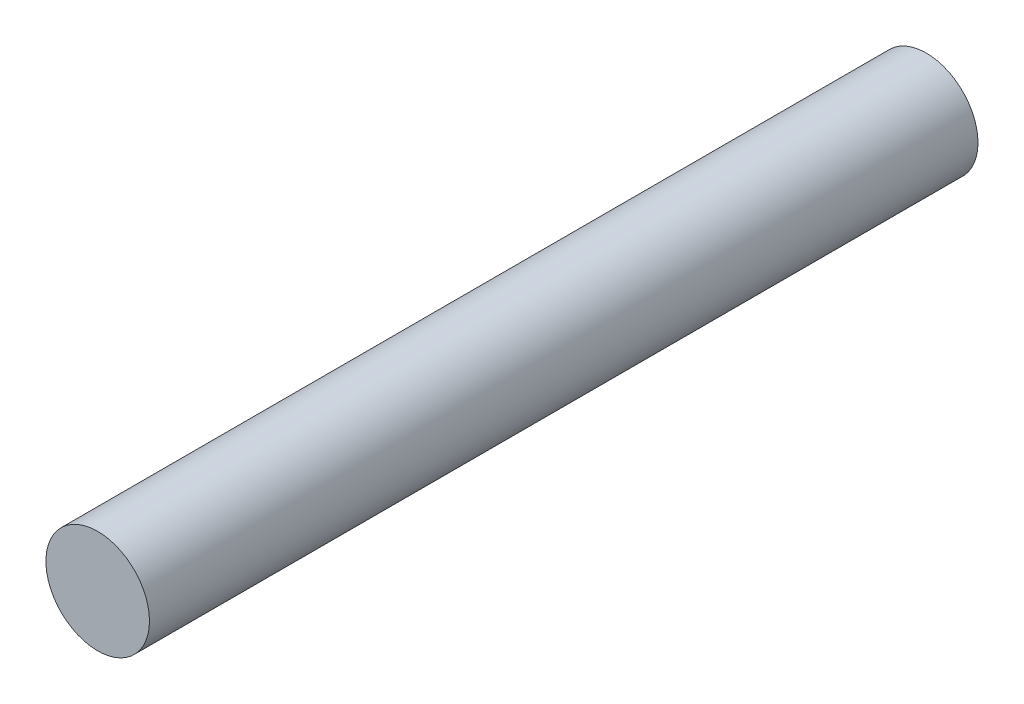
ISO-10303-21;
HEADER;
FILE_DESCRIPTION(('STEP AP214'),'2;1');
FILE_NAME('part.step','',(''),(''),'','','');
FILE_SCHEMA(('AUTOMOTIVE_DESIGN { 1 0 10303 214 1 1 1 1 }'));
ENDSEC;
DATA;
#1=APPLICATION_CONTEXT('core data for automotive mechanical design processes');
#2=APPLICATION_PROTOCOL_DEFINITION('international standard','automotive_design',2000,#1);
#3=PRODUCT_CONTEXT('',#1,'mechanical');
#4=PRODUCT('Part','Part','',(#3));
#5=PRODUCT_RELATED_PRODUCT_CATEGORY('part','',(#4));
#6=PRODUCT_DEFINITION_FORMATION('','',#4);
#7=PRODUCT_DEFINITION_CONTEXT('part definition',#1,'design');
#8=PRODUCT_DEFINITION('design','',#6,#7);
#9=PRODUCT_DEFINITION_SHAPE('','',#8);
#10=(LENGTH_UNIT() NAMED_UNIT(*) SI_UNIT(.MILLI.,.METRE.));
#11=(NAMED_UNIT(*) PLANE_ANGLE_UNIT() SI_UNIT($,.RADIAN.));
#12=(NAMED_UNIT(*) SI_UNIT($,.STERADIAN.) SOLID_ANGLE_UNIT());
#13=UNCERTAINTY_MEASURE_WITH_UNIT(LENGTH_MEASURE(1.E-05),#10,'distance_accuracy_value','');
#14=(GEOMETRIC_REPRESENTATION_CONTEXT(3) GLOBAL_UNCERTAINTY_ASSIGNED_CONTEXT((#13)) GLOBAL_UNIT_ASSIGNED_CONTEXT((#10,
#11,#12)) REPRESENTATION_CONTEXT('',''));
#15=CARTESIAN_POINT('',(0.,0.,0.));
#16=DIRECTION('',(0.,0.,1.));
#17=DIRECTION('',(1.,0.,0.));
#18=AXIS2_PLACEMENT_3D('',#15,#16,#17);
#19=CARTESIAN_POINT('',(0.,0.,400.));
#20=DIRECTION('',(0.,0.,-1.));
#21=DIRECTION('',(-1.,0.,0.));
#22=AXIS2_PLACEMENT_3D('',#19,#20,#21);
#23=CYLINDRICAL_SURFACE('',#22,25.);
#24=CARTESIAN_POINT('',(0.,0.,400.));
#25=DIRECTION('',(0.,0.,1.));
#26=DIRECTION('',(1.,0.,0.));
#27=AXIS2_PLACEMENT_3D('',#24,#25,#26);
#28=CIRCLE('',#27,25.);
#29=CARTESIAN_POINT('',(25.,0.,400.));
#30=VERTEX_POINT('',#29);
#31=EDGE_CURVE('E10',#30,#30,#28,.T.);
#32=ORIENTED_EDGE('',*,*,#31,.F.);
#33=EDGE_LOOP('',(#32));
#34=FACE_BOUND('',#33,.T.);
#35=CARTESIAN_POINT('',(0.,0.,0.));
#36=DIRECTION('',(0.,0.,1.));
#37=DIRECTION('',(1.,0.,0.));
#38=AXIS2_PLACEMENT_3D('',#35,#36,#37);
#39=CIRCLE('',#38,25.);
#40=CARTESIAN_POINT('',(25.,0.,0.));
#41=VERTEX_POINT('',#40);
#42=EDGE_CURVE('E32',#41,#41,#39,.T.);
#43=ORIENTED_EDGE('',*,*,#42,.T.);
#44=EDGE_LOOP('',(#43));
#45=FACE_BOUND('',#44,.T.);
#46=ADVANCED_FACE('F29',(#34,#45),#23,.T.);
#47=CARTESIAN_POINT('',(0.,0.,400.));
#48=DIRECTION('',(0.,0.,1.));
#49=DIRECTION('',(1.,0.,0.));
#50=AXIS2_PLACEMENT_3D('',#47,#48,#49);
#51=PLANE('',#50);
#52=ORIENTED_EDGE('',*,*,#31,.T.);
#53=EDGE_LOOP('',(#52));
#54=FACE_BOUND('',#53,.T.);
#55=ADVANCED_FACE('F44',(#54),#51,.T.);
#56=CARTESIAN_POINT('',(0.,0.,0.));
#57=DIRECTION('',(0.,0.,1.));
#58=DIRECTION('',(1.,0.,0.));
#59=AXIS2_PLACEMENT_3D('',#56,#57,#58);
#60=PLANE('',#59);
#61=ORIENTED_EDGE('',*,*,#42,.F.);
#62=EDGE_LOOP('',(#61));
#63=FACE_BOUND('',#62,.T.);
#64=ADVANCED_FACE('F42',(#63),#60,.F.);
#65=CLOSED_SHELL('',(#46,#55,#64));
#66=MANIFOLD_SOLID_BREP('B2',#65);
#67=ADVANCED_BREP_SHAPE_REPRESENTATION('',(#18,#66),#14);
#68=SHAPE_DEFINITION_REPRESENTATION(#9,#67);
ENDSEC;
END-ISO-10303-21;
